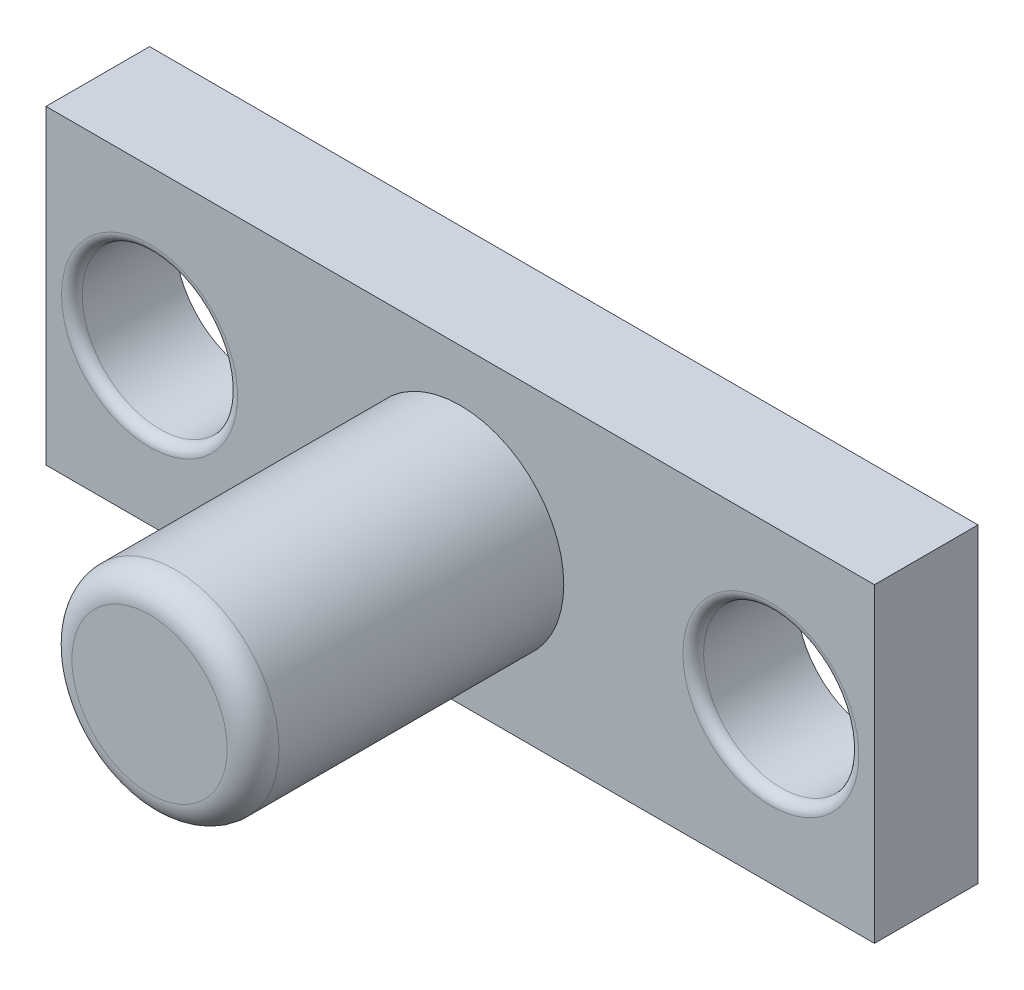
ISO-10303-21;
HEADER;
FILE_DESCRIPTION(('STEP AP214'),'2;1');
FILE_NAME('part.step','',(''),(''),'','','');
FILE_SCHEMA(('AUTOMOTIVE_DESIGN { 1 0 10303 214 1 1 1 1 }'));
ENDSEC;
DATA;
#1=APPLICATION_CONTEXT('core data for automotive mechanical design processes');
#2=APPLICATION_PROTOCOL_DEFINITION('international standard','automotive_design',2000,#1);
#3=PRODUCT_CONTEXT('',#1,'mechanical');
#4=PRODUCT('Part','Part','',(#3));
#5=PRODUCT_RELATED_PRODUCT_CATEGORY('part','',(#4));
#6=PRODUCT_DEFINITION_FORMATION('','',#4);
#7=PRODUCT_DEFINITION_CONTEXT('part definition',#1,'design');
#8=PRODUCT_DEFINITION('design','',#6,#7);
#9=PRODUCT_DEFINITION_SHAPE('','',#8);
#10=(LENGTH_UNIT() NAMED_UNIT(*) SI_UNIT(.MILLI.,.METRE.));
#11=(NAMED_UNIT(*) PLANE_ANGLE_UNIT() SI_UNIT($,.RADIAN.));
#12=(NAMED_UNIT(*) SI_UNIT($,.STERADIAN.) SOLID_ANGLE_UNIT());
#13=UNCERTAINTY_MEASURE_WITH_UNIT(LENGTH_MEASURE(1.E-05),#10,'distance_accuracy_value','');
#14=(GEOMETRIC_REPRESENTATION_CONTEXT(3) GLOBAL_UNCERTAINTY_ASSIGNED_CONTEXT((#13)) GLOBAL_UNIT_ASSIGNED_CONTEXT((#10,
#11,#12)) REPRESENTATION_CONTEXT('',''));
#15=CARTESIAN_POINT('',(0.,0.,0.));
#16=DIRECTION('',(0.,0.,1.));
#17=DIRECTION('',(1.,0.,0.));
#18=AXIS2_PLACEMENT_3D('',#15,#16,#17);
#19=CARTESIAN_POINT('',(80.,-30.,20.));
#20=DIRECTION('',(-1.,0.,0.));
#21=DIRECTION('',(0.,0.,1.));
#22=AXIS2_PLACEMENT_3D('',#19,#20,#21);
#23=PLANE('',#22);
#24=DIRECTION('',(0.,1.,0.));
#25=VECTOR('',#24,1.);
#26=CARTESIAN_POINT('',(80.,-30.,0.));
#27=LINE('',#26,#25);
#28=CARTESIAN_POINT('',(80.,-30.,0.));
#29=VERTEX_POINT('',#28);
#30=CARTESIAN_POINT('',(80.,30.,0.));
#31=VERTEX_POINT('',#30);
#32=EDGE_CURVE('E101',#29,#31,#27,.T.);
#33=ORIENTED_EDGE('',*,*,#32,.T.);
#34=DIRECTION('',(0.,0.,-1.));
#35=VECTOR('',#34,1.);
#36=CARTESIAN_POINT('',(80.,30.,20.));
#37=LINE('',#36,#35);
#38=CARTESIAN_POINT('',(80.,30.,20.));
#39=VERTEX_POINT('',#38);
#40=EDGE_CURVE('E92',#39,#31,#37,.T.);
#41=ORIENTED_EDGE('',*,*,#40,.F.);
#42=DIRECTION('',(0.,1.,0.));
#43=VECTOR('',#42,1.);
#44=CARTESIAN_POINT('',(80.,-30.,20.));
#45=LINE('',#44,#43);
#46=CARTESIAN_POINT('',(80.,-30.,20.));
#47=VERTEX_POINT('',#46);
#48=EDGE_CURVE('E86',#47,#39,#45,.T.);
#49=ORIENTED_EDGE('',*,*,#48,.F.);
#50=DIRECTION('',(0.,0.,-1.));
#51=VECTOR('',#50,1.);
#52=CARTESIAN_POINT('',(80.,-30.,20.));
#53=LINE('',#52,#51);
#54=EDGE_CURVE('E97',#47,#29,#53,.T.);
#55=ORIENTED_EDGE('',*,*,#54,.T.);
#56=EDGE_LOOP('',(#33,#41,#49,#55));
#57=FACE_BOUND('',#56,.T.);
#58=ADVANCED_FACE('F33',(#57),#23,.F.);
#59=CARTESIAN_POINT('',(-80.,30.,20.));
#60=DIRECTION('',(0.,-1.,0.));
#61=DIRECTION('',(0.,0.,-1.));
#62=AXIS2_PLACEMENT_3D('',#59,#60,#61);
#63=PLANE('',#62);
#64=DIRECTION('',(-1.,0.,0.));
#65=VECTOR('',#64,1.);
#66=CARTESIAN_POINT('',(-80.,30.,0.));
#67=LINE('',#66,#65);
#68=CARTESIAN_POINT('',(-80.,30.,0.));
#69=VERTEX_POINT('',#68);
#70=EDGE_CURVE('E91',#31,#69,#67,.T.);
#71=ORIENTED_EDGE('',*,*,#70,.T.);
#72=DIRECTION('',(0.,0.,-1.));
#73=VECTOR('',#72,1.);
#74=CARTESIAN_POINT('',(-80.,30.,20.));
#75=LINE('',#74,#73);
#76=CARTESIAN_POINT('',(-80.,30.,20.));
#77=VERTEX_POINT('',#76);
#78=EDGE_CURVE('E89',#77,#69,#75,.T.);
#79=ORIENTED_EDGE('',*,*,#78,.F.);
#80=DIRECTION('',(-1.,0.,0.));
#81=VECTOR('',#80,1.);
#82=CARTESIAN_POINT('',(-80.,30.,20.));
#83=LINE('',#82,#81);
#84=EDGE_CURVE('E81',#39,#77,#83,.T.);
#85=ORIENTED_EDGE('',*,*,#84,.F.);
#86=ORIENTED_EDGE('',*,*,#40,.T.);
#87=EDGE_LOOP('',(#71,#79,#85,#86));
#88=FACE_BOUND('',#87,.T.);
#89=ADVANCED_FACE('F90',(#88),#63,.F.);
#90=CARTESIAN_POINT('',(-80.,-30.,20.));
#91=DIRECTION('',(1.,0.,0.));
#92=DIRECTION('',(0.,0.,-1.));
#93=AXIS2_PLACEMENT_3D('',#90,#91,#92);
#94=PLANE('',#93);
#95=DIRECTION('',(0.,-1.,0.));
#96=VECTOR('',#95,1.);
#97=CARTESIAN_POINT('',(-80.,-30.,0.));
#98=LINE('',#97,#96);
#99=CARTESIAN_POINT('',(-80.,-30.,0.));
#100=VERTEX_POINT('',#99);
#101=EDGE_CURVE('E67',#69,#100,#98,.T.);
#102=ORIENTED_EDGE('',*,*,#101,.T.);
#103=DIRECTION('',(0.,0.,-1.));
#104=VECTOR('',#103,1.);
#105=CARTESIAN_POINT('',(-80.,-30.,20.));
#106=LINE('',#105,#104);
#107=CARTESIAN_POINT('',(-80.,-30.,20.));
#108=VERTEX_POINT('',#107);
#109=EDGE_CURVE('E93',#108,#100,#106,.T.);
#110=ORIENTED_EDGE('',*,*,#109,.F.);
#111=DIRECTION('',(0.,-1.,0.));
#112=VECTOR('',#111,1.);
#113=CARTESIAN_POINT('',(-80.,-30.,20.));
#114=LINE('',#113,#112);
#115=EDGE_CURVE('E84',#77,#108,#114,.T.);
#116=ORIENTED_EDGE('',*,*,#115,.F.);
#117=ORIENTED_EDGE('',*,*,#78,.T.);
#118=EDGE_LOOP('',(#102,#110,#116,#117));
#119=FACE_BOUND('',#118,.T.);
#120=ADVANCED_FACE('F95',(#119),#94,.F.);
#121=CARTESIAN_POINT('',(-80.,-30.,20.));
#122=DIRECTION('',(0.,1.,0.));
#123=DIRECTION('',(0.,0.,1.));
#124=AXIS2_PLACEMENT_3D('',#121,#122,#123);
#125=PLANE('',#124);
#126=DIRECTION('',(1.,0.,0.));
#127=VECTOR('',#126,1.);
#128=CARTESIAN_POINT('',(-80.,-30.,0.));
#129=LINE('',#128,#127);
#130=EDGE_CURVE('E73',#100,#29,#129,.T.);
#131=ORIENTED_EDGE('',*,*,#130,.T.);
#132=ORIENTED_EDGE('',*,*,#54,.F.);
#133=DIRECTION('',(1.,0.,0.));
#134=VECTOR('',#133,1.);
#135=CARTESIAN_POINT('',(-80.,-30.,20.));
#136=LINE('',#135,#134);
#137=EDGE_CURVE('E50',#108,#47,#136,.T.);
#138=ORIENTED_EDGE('',*,*,#137,.F.);
#139=ORIENTED_EDGE('',*,*,#109,.T.);
#140=EDGE_LOOP('',(#131,#132,#138,#139));
#141=FACE_BOUND('',#140,.T.);
#142=ADVANCED_FACE('F174',(#141),#125,.F.);
#143=CARTESIAN_POINT('',(0.,0.,20.));
#144=DIRECTION('',(0.,0.,-1.));
#145=DIRECTION('',(-1.,0.,0.));
#146=AXIS2_PLACEMENT_3D('',#143,#144,#145);
#147=PLANE('',#146);
#148=CARTESIAN_POINT('',(60.,0.,20.));
#149=DIRECTION('',(0.,0.,-1.));
#150=DIRECTION('',(-1.,0.,0.));
#151=AXIS2_PLACEMENT_3D('',#148,#149,#150);
#152=CIRCLE('',#151,17.);
#153=CARTESIAN_POINT('',(43.,0.,20.));
#154=VERTEX_POINT('',#153);
#155=EDGE_CURVE('E11',#154,#154,#152,.T.);
#156=ORIENTED_EDGE('',*,*,#155,.T.);
#157=EDGE_LOOP('',(#156));
#158=FACE_BOUND('',#157,.T.);
#159=CARTESIAN_POINT('',(-60.,0.,20.));
#160=DIRECTION('',(0.,0.,-1.));
#161=DIRECTION('',(-1.,0.,0.));
#162=AXIS2_PLACEMENT_3D('',#159,#160,#161);
#163=CIRCLE('',#162,17.);
#164=CARTESIAN_POINT('',(-77.,0.,20.));
#165=VERTEX_POINT('',#164);
#166=EDGE_CURVE('E121',#165,#165,#163,.T.);
#167=ORIENTED_EDGE('',*,*,#166,.T.);
#168=EDGE_LOOP('',(#167));
#169=FACE_BOUND('',#168,.T.);
#170=CARTESIAN_POINT('',(0.,0.,20.));
#171=DIRECTION('',(0.,0.,-1.));
#172=DIRECTION('',(-1.,0.,0.));
#173=AXIS2_PLACEMENT_3D('',#170,#171,#172);
#174=CIRCLE('',#173,20.);
#175=CARTESIAN_POINT('',(-20.,0.,20.));
#176=VERTEX_POINT('',#175);
#177=EDGE_CURVE('E111',#176,#176,#174,.F.);
#178=ORIENTED_EDGE('',*,*,#177,.F.);
#179=EDGE_LOOP('',(#178));
#180=FACE_BOUND('',#179,.T.);
#181=ORIENTED_EDGE('',*,*,#48,.T.);
#182=ORIENTED_EDGE('',*,*,#84,.T.);
#183=ORIENTED_EDGE('',*,*,#115,.T.);
#184=ORIENTED_EDGE('',*,*,#137,.T.);
#185=EDGE_LOOP('',(#181,#182,#183,#184));
#186=FACE_BOUND('',#185,.T.);
#187=ADVANCED_FACE('F82',(#158,#169,#180,#186),#147,.F.);
#188=CARTESIAN_POINT('',(0.,0.,0.));
#189=DIRECTION('',(0.,0.,-1.));
#190=DIRECTION('',(-1.,0.,0.));
#191=AXIS2_PLACEMENT_3D('',#188,#189,#190);
#192=PLANE('',#191);
#193=CARTESIAN_POINT('',(-60.,0.,0.));
#194=DIRECTION('',(0.,0.,1.));
#195=DIRECTION('',(1.,0.,0.));
#196=AXIS2_PLACEMENT_3D('',#193,#194,#195);
#197=CIRCLE('',#196,15.);
#198=CARTESIAN_POINT('',(-45.,0.,0.));
#199=VERTEX_POINT('',#198);
#200=EDGE_CURVE('E104',#199,#199,#197,.T.);
#201=ORIENTED_EDGE('',*,*,#200,.T.);
#202=EDGE_LOOP('',(#201));
#203=FACE_BOUND('',#202,.T.);
#204=CARTESIAN_POINT('',(60.,0.,0.));
#205=DIRECTION('',(0.,0.,1.));
#206=DIRECTION('',(1.,0.,0.));
#207=AXIS2_PLACEMENT_3D('',#204,#205,#206);
#208=CIRCLE('',#207,15.);
#209=CARTESIAN_POINT('',(75.,0.,0.));
#210=VERTEX_POINT('',#209);
#211=EDGE_CURVE('E257',#210,#210,#208,.T.);
#212=ORIENTED_EDGE('',*,*,#211,.T.);
#213=EDGE_LOOP('',(#212));
#214=FACE_BOUND('',#213,.T.);
#215=ORIENTED_EDGE('',*,*,#32,.F.);
#216=ORIENTED_EDGE('',*,*,#130,.F.);
#217=ORIENTED_EDGE('',*,*,#101,.F.);
#218=ORIENTED_EDGE('',*,*,#70,.F.);
#219=EDGE_LOOP('',(#215,#216,#217,#218));
#220=FACE_BOUND('',#219,.T.);
#221=ADVANCED_FACE('F168',(#203,#214,#220),#192,.T.);
#222=CARTESIAN_POINT('',(0.,0.,80.));
#223=DIRECTION('',(0.,0.,-1.));
#224=DIRECTION('',(-1.,0.,0.));
#225=AXIS2_PLACEMENT_3D('',#222,#223,#224);
#226=CYLINDRICAL_SURFACE('',#225,20.);
#227=CARTESIAN_POINT('',(0.,0.,75.));
#228=DIRECTION('',(0.,0.,1.));
#229=DIRECTION('',(1.,0.,0.));
#230=AXIS2_PLACEMENT_3D('',#227,#228,#229);
#231=CIRCLE('',#230,20.);
#232=CARTESIAN_POINT('',(20.,0.,75.));
#233=VERTEX_POINT('',#232);
#234=EDGE_CURVE('E115',#233,#233,#231,.F.);
#235=ORIENTED_EDGE('',*,*,#234,.T.);
#236=EDGE_LOOP('',(#235));
#237=FACE_BOUND('',#236,.T.);
#238=ORIENTED_EDGE('',*,*,#177,.T.);
#239=EDGE_LOOP('',(#238));
#240=FACE_BOUND('',#239,.T.);
#241=ADVANCED_FACE('F161',(#237,#240),#226,.T.);
#242=CARTESIAN_POINT('',(0.,0.,80.));
#243=DIRECTION('',(0.,0.,1.));
#244=DIRECTION('',(1.,0.,0.));
#245=AXIS2_PLACEMENT_3D('',#242,#243,#244);
#246=PLANE('',#245);
#247=CARTESIAN_POINT('',(0.,0.,80.));
#248=DIRECTION('',(0.,0.,1.));
#249=DIRECTION('',(1.,0.,0.));
#250=AXIS2_PLACEMENT_3D('',#247,#248,#249);
#251=CIRCLE('',#250,15.);
#252=CARTESIAN_POINT('',(15.,0.,80.));
#253=VERTEX_POINT('',#252);
#254=EDGE_CURVE('E112',#253,#253,#251,.T.);
#255=ORIENTED_EDGE('',*,*,#254,.T.);
#256=EDGE_LOOP('',(#255));
#257=FACE_BOUND('',#256,.T.);
#258=ADVANCED_FACE('F159',(#257),#246,.T.);
#259=CARTESIAN_POINT('',(60.,0.,20.));
#260=DIRECTION('',(0.,0.,-1.));
#261=DIRECTION('',(-1.,0.,0.));
#262=AXIS2_PLACEMENT_3D('',#259,#260,#261);
#263=CYLINDRICAL_SURFACE('',#262,15.);
#264=CARTESIAN_POINT('',(60.,0.,18.));
#265=DIRECTION('',(0.,0.,-1.));
#266=DIRECTION('',(-1.,0.,0.));
#267=AXIS2_PLACEMENT_3D('',#264,#265,#266);
#268=CIRCLE('',#267,15.);
#269=CARTESIAN_POINT('',(45.,0.,18.));
#270=VERTEX_POINT('',#269);
#271=EDGE_CURVE('E42',#270,#270,#268,.F.);
#272=ORIENTED_EDGE('',*,*,#271,.T.);
#273=EDGE_LOOP('',(#272));
#274=FACE_BOUND('',#273,.T.);
#275=ORIENTED_EDGE('',*,*,#211,.F.);
#276=EDGE_LOOP('',(#275));
#277=FACE_BOUND('',#276,.T.);
#278=ADVANCED_FACE('F126',(#274,#277),#263,.F.);
#279=CARTESIAN_POINT('',(-60.,0.,20.));
#280=DIRECTION('',(0.,0.,-1.));
#281=DIRECTION('',(-1.,0.,0.));
#282=AXIS2_PLACEMENT_3D('',#279,#280,#281);
#283=CYLINDRICAL_SURFACE('',#282,15.);
#284=CARTESIAN_POINT('',(-60.,0.,18.));
#285=DIRECTION('',(0.,0.,-1.));
#286=DIRECTION('',(-1.,0.,0.));
#287=AXIS2_PLACEMENT_3D('',#284,#285,#286);
#288=CIRCLE('',#287,15.);
#289=CARTESIAN_POINT('',(-75.,0.,18.));
#290=VERTEX_POINT('',#289);
#291=EDGE_CURVE('E118',#290,#290,#288,.F.);
#292=ORIENTED_EDGE('',*,*,#291,.T.);
#293=EDGE_LOOP('',(#292));
#294=FACE_BOUND('',#293,.T.);
#295=ORIENTED_EDGE('',*,*,#200,.F.);
#296=EDGE_LOOP('',(#295));
#297=FACE_BOUND('',#296,.T.);
#298=ADVANCED_FACE('F148',(#294,#297),#283,.F.);
#299=CARTESIAN_POINT('',(0.,0.,75.));
#300=DIRECTION('',(0.,0.,1.));
#301=DIRECTION('',(1.,0.,0.));
#302=AXIS2_PLACEMENT_3D('',#299,#300,#301);
#303=TOROIDAL_SURFACE('',#302,15.,5.);
#304=ORIENTED_EDGE('',*,*,#234,.F.);
#305=EDGE_LOOP('',(#304));
#306=FACE_BOUND('',#305,.T.);
#307=ORIENTED_EDGE('',*,*,#254,.F.);
#308=EDGE_LOOP('',(#307));
#309=FACE_BOUND('',#308,.T.);
#310=ADVANCED_FACE('F135',(#306,#309),#303,.T.);
#311=CARTESIAN_POINT('',(-60.,0.,18.));
#312=DIRECTION('',(0.,0.,-1.));
#313=DIRECTION('',(-1.,0.,0.));
#314=AXIS2_PLACEMENT_3D('',#311,#312,#313);
#315=TOROIDAL_SURFACE('',#314,17.,2.);
#316=ORIENTED_EDGE('',*,*,#166,.F.);
#317=EDGE_LOOP('',(#316));
#318=FACE_BOUND('',#317,.T.);
#319=ORIENTED_EDGE('',*,*,#291,.F.);
#320=EDGE_LOOP('',(#319));
#321=FACE_BOUND('',#320,.T.);
#322=ADVANCED_FACE('F130',(#318,#321),#315,.T.);
#323=CARTESIAN_POINT('',(60.,0.,18.));
#324=DIRECTION('',(0.,0.,-1.));
#325=DIRECTION('',(-1.,0.,0.));
#326=AXIS2_PLACEMENT_3D('',#323,#324,#325);
#327=TOROIDAL_SURFACE('',#326,17.,2.);
#328=ORIENTED_EDGE('',*,*,#155,.F.);
#329=EDGE_LOOP('',(#328));
#330=FACE_BOUND('',#329,.T.);
#331=ORIENTED_EDGE('',*,*,#271,.F.);
#332=EDGE_LOOP('',(#331));
#333=FACE_BOUND('',#332,.T.);
#334=ADVANCED_FACE('F35',(#330,#333),#327,.T.);
#335=CLOSED_SHELL('',(#58,#89,#120,#142,#187,#221,#241,#258,#278,#298,#310,#322,#334));
#336=MANIFOLD_SOLID_BREP('B2',#335);
#337=ADVANCED_BREP_SHAPE_REPRESENTATION('',(#18,#336),#14);
#338=SHAPE_DEFINITION_REPRESENTATION(#9,#337);
ENDSEC;
END-ISO-10303-21;
